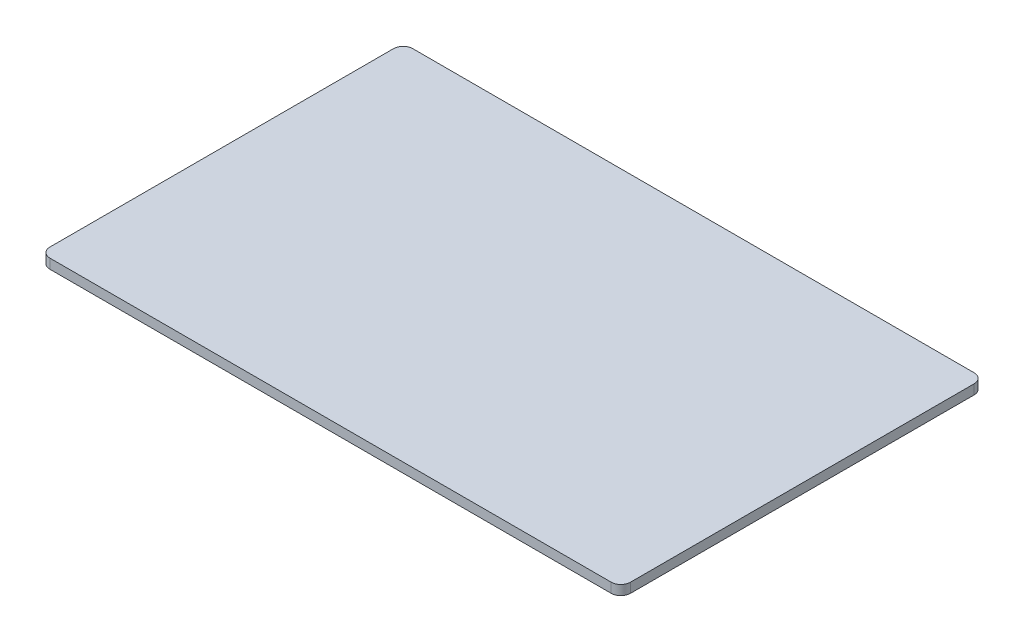
ISO-10303-21;
HEADER;
FILE_DESCRIPTION(('STEP AP214'),'2;1');
FILE_NAME('part.step','',(''),(''),'','','');
FILE_SCHEMA(('AUTOMOTIVE_DESIGN { 1 0 10303 214 1 1 1 1 }'));
ENDSEC;
DATA;
#1=APPLICATION_CONTEXT('core data for automotive mechanical design processes');
#2=APPLICATION_PROTOCOL_DEFINITION('international standard','automotive_design',2000,#1);
#3=PRODUCT_CONTEXT('',#1,'mechanical');
#4=PRODUCT('Part','Part','',(#3));
#5=PRODUCT_RELATED_PRODUCT_CATEGORY('part','',(#4));
#6=PRODUCT_DEFINITION_FORMATION('','',#4);
#7=PRODUCT_DEFINITION_CONTEXT('part definition',#1,'design');
#8=PRODUCT_DEFINITION('design','',#6,#7);
#9=PRODUCT_DEFINITION_SHAPE('','',#8);
#10=(LENGTH_UNIT() NAMED_UNIT(*) SI_UNIT(.MILLI.,.METRE.));
#11=(NAMED_UNIT(*) PLANE_ANGLE_UNIT() SI_UNIT($,.RADIAN.));
#12=(NAMED_UNIT(*) SI_UNIT($,.STERADIAN.) SOLID_ANGLE_UNIT());
#13=UNCERTAINTY_MEASURE_WITH_UNIT(LENGTH_MEASURE(1.E-05),#10,'distance_accuracy_value','');
#14=(GEOMETRIC_REPRESENTATION_CONTEXT(3) GLOBAL_UNCERTAINTY_ASSIGNED_CONTEXT((#13)) GLOBAL_UNIT_ASSIGNED_CONTEXT((#10,
#11,#12)) REPRESENTATION_CONTEXT('',''));
#15=CARTESIAN_POINT('',(0.,0.,0.));
#16=DIRECTION('',(0.,0.,1.));
#17=DIRECTION('',(1.,0.,0.));
#18=AXIS2_PLACEMENT_3D('',#15,#16,#17);
#19=CARTESIAN_POINT('',(-59.0049751243781,2.,-36.2189054726368));
#20=DIRECTION('',(1.,0.,0.));
#21=DIRECTION('',(0.,0.,-1.));
#22=AXIS2_PLACEMENT_3D('',#19,#20,#21);
#23=PLANE('',#22);
#24=DIRECTION('',(0.,0.,1.));
#25=VECTOR('',#24,1.);
#26=CARTESIAN_POINT('',(-59.0049751243781,2.,-36.2189054726368));
#27=LINE('',#26,#25);
#28=CARTESIAN_POINT('',(-59.0049751243781,2.,-34.2189054726368));
#29=VERTEX_POINT('',#28);
#30=CARTESIAN_POINT('',(-59.0049751243781,2.,36.7810945273632));
#31=VERTEX_POINT('',#30);
#32=EDGE_CURVE('E126',#29,#31,#27,.T.);
#33=ORIENTED_EDGE('',*,*,#32,.F.);
#34=DIRECTION('',(0.,-1.,0.));
#35=VECTOR('',#34,1.);
#36=CARTESIAN_POINT('',(-59.0049751243781,2.,-34.2189054726368));
#37=LINE('',#36,#35);
#38=CARTESIAN_POINT('',(-59.0049751243781,0.,-34.2189054726368));
#39=VERTEX_POINT('',#38);
#40=EDGE_CURVE('E111',#29,#39,#37,.T.);
#41=ORIENTED_EDGE('',*,*,#40,.T.);
#42=DIRECTION('',(0.,0.,1.));
#43=VECTOR('',#42,1.);
#44=CARTESIAN_POINT('',(-59.0049751243781,0.,-36.2189054726368));
#45=LINE('',#44,#43);
#46=CARTESIAN_POINT('',(-59.0049751243781,0.,36.7810945273632));
#47=VERTEX_POINT('',#46);
#48=EDGE_CURVE('E123',#39,#47,#45,.T.);
#49=ORIENTED_EDGE('',*,*,#48,.T.);
#50=DIRECTION('',(0.,-1.,0.));
#51=VECTOR('',#50,1.);
#52=CARTESIAN_POINT('',(-59.0049751243781,2.,36.7810945273632));
#53=LINE('',#52,#51);
#54=EDGE_CURVE('E128',#47,#31,#53,.F.);
#55=ORIENTED_EDGE('',*,*,#54,.T.);
#56=EDGE_LOOP('',(#33,#41,#49,#55));
#57=FACE_BOUND('',#56,.T.);
#58=ADVANCED_FACE('F41',(#57),#23,.F.);
#59=CARTESIAN_POINT('',(-59.0049751243781,2.,38.7810945273632));
#60=DIRECTION('',(0.,0.,-1.));
#61=DIRECTION('',(-1.,0.,0.));
#62=AXIS2_PLACEMENT_3D('',#59,#60,#61);
#63=PLANE('',#62);
#64=DIRECTION('',(1.,0.,0.));
#65=VECTOR('',#64,1.);
#66=CARTESIAN_POINT('',(-59.0049751243781,0.,38.7810945273632));
#67=LINE('',#66,#65);
#68=CARTESIAN_POINT('',(-57.0049751243781,0.,38.7810945273632));
#69=VERTEX_POINT('',#68);
#70=CARTESIAN_POINT('',(58.9950248756219,0.,38.7810945273632));
#71=VERTEX_POINT('',#70);
#72=EDGE_CURVE('E132',#69,#71,#67,.T.);
#73=ORIENTED_EDGE('',*,*,#72,.T.);
#74=DIRECTION('',(0.,-1.,0.));
#75=VECTOR('',#74,1.);
#76=CARTESIAN_POINT('',(58.9950248756219,2.,38.7810945273632));
#77=LINE('',#76,#75);
#78=CARTESIAN_POINT('',(58.9950248756219,2.,38.7810945273632));
#79=VERTEX_POINT('',#78);
#80=EDGE_CURVE('E11',#71,#79,#77,.F.);
#81=ORIENTED_EDGE('',*,*,#80,.T.);
#82=DIRECTION('',(1.,0.,0.));
#83=VECTOR('',#82,1.);
#84=CARTESIAN_POINT('',(-59.0049751243781,2.,38.7810945273632));
#85=LINE('',#84,#83);
#86=CARTESIAN_POINT('',(-57.0049751243781,2.,38.7810945273632));
#87=VERTEX_POINT('',#86);
#88=EDGE_CURVE('E168',#87,#79,#85,.T.);
#89=ORIENTED_EDGE('',*,*,#88,.F.);
#90=DIRECTION('',(0.,-1.,0.));
#91=VECTOR('',#90,1.);
#92=CARTESIAN_POINT('',(-57.0049751243781,2.,38.7810945273632));
#93=LINE('',#92,#91);
#94=EDGE_CURVE('E49',#87,#69,#93,.T.);
#95=ORIENTED_EDGE('',*,*,#94,.T.);
#96=EDGE_LOOP('',(#73,#81,#89,#95));
#97=FACE_BOUND('',#96,.T.);
#98=ADVANCED_FACE('F166',(#97),#63,.F.);
#99=CARTESIAN_POINT('',(60.9950248756219,2.,-36.2189054726368));
#100=DIRECTION('',(-1.,0.,0.));
#101=DIRECTION('',(0.,0.,1.));
#102=AXIS2_PLACEMENT_3D('',#99,#100,#101);
#103=PLANE('',#102);
#104=DIRECTION('',(0.,0.,-1.));
#105=VECTOR('',#104,1.);
#106=CARTESIAN_POINT('',(60.9950248756219,0.,-36.2189054726368));
#107=LINE('',#106,#105);
#108=CARTESIAN_POINT('',(60.9950248756219,0.,36.7810945273632));
#109=VERTEX_POINT('',#108);
#110=CARTESIAN_POINT('',(60.9950248756219,0.,-34.2189054726368));
#111=VERTEX_POINT('',#110);
#112=EDGE_CURVE('E135',#109,#111,#107,.T.);
#113=ORIENTED_EDGE('',*,*,#112,.T.);
#114=DIRECTION('',(0.,-1.,0.));
#115=VECTOR('',#114,1.);
#116=CARTESIAN_POINT('',(60.9950248756219,2.,-34.2189054726368));
#117=LINE('',#116,#115);
#118=CARTESIAN_POINT('',(60.9950248756219,2.,-34.2189054726368));
#119=VERTEX_POINT('',#118);
#120=EDGE_CURVE('E56',#111,#119,#117,.F.);
#121=ORIENTED_EDGE('',*,*,#120,.T.);
#122=DIRECTION('',(0.,0.,-1.));
#123=VECTOR('',#122,1.);
#124=CARTESIAN_POINT('',(60.9950248756219,2.,-36.2189054726368));
#125=LINE('',#124,#123);
#126=CARTESIAN_POINT('',(60.9950248756219,2.,36.7810945273632));
#127=VERTEX_POINT('',#126);
#128=EDGE_CURVE('E176',#127,#119,#125,.T.);
#129=ORIENTED_EDGE('',*,*,#128,.F.);
#130=DIRECTION('',(0.,-1.,0.));
#131=VECTOR('',#130,1.);
#132=CARTESIAN_POINT('',(60.9950248756219,2.,36.7810945273632));
#133=LINE('',#132,#131);
#134=EDGE_CURVE('E159',#127,#109,#133,.T.);
#135=ORIENTED_EDGE('',*,*,#134,.T.);
#136=EDGE_LOOP('',(#113,#121,#129,#135));
#137=FACE_BOUND('',#136,.T.);
#138=ADVANCED_FACE('F175',(#137),#103,.F.);
#139=CARTESIAN_POINT('',(-59.0049751243781,2.,-36.2189054726368));
#140=DIRECTION('',(0.,0.,1.));
#141=DIRECTION('',(1.,0.,0.));
#142=AXIS2_PLACEMENT_3D('',#139,#140,#141);
#143=PLANE('',#142);
#144=DIRECTION('',(-1.,0.,0.));
#145=VECTOR('',#144,1.);
#146=CARTESIAN_POINT('',(-59.0049751243781,0.,-36.2189054726368));
#147=LINE('',#146,#145);
#148=CARTESIAN_POINT('',(58.9950248756219,0.,-36.2189054726368));
#149=VERTEX_POINT('',#148);
#150=CARTESIAN_POINT('',(-57.0049751243781,0.,-36.2189054726368));
#151=VERTEX_POINT('',#150);
#152=EDGE_CURVE('E142',#149,#151,#147,.T.);
#153=ORIENTED_EDGE('',*,*,#152,.T.);
#154=DIRECTION('',(0.,-1.,0.));
#155=VECTOR('',#154,1.);
#156=CARTESIAN_POINT('',(-57.0049751243781,2.,-36.2189054726368));
#157=LINE('',#156,#155);
#158=CARTESIAN_POINT('',(-57.0049751243781,2.,-36.2189054726368));
#159=VERTEX_POINT('',#158);
#160=EDGE_CURVE('E112',#151,#159,#157,.F.);
#161=ORIENTED_EDGE('',*,*,#160,.T.);
#162=DIRECTION('',(-1.,0.,0.));
#163=VECTOR('',#162,1.);
#164=CARTESIAN_POINT('',(-59.0049751243781,2.,-36.2189054726368));
#165=LINE('',#164,#163);
#166=CARTESIAN_POINT('',(58.9950248756219,2.,-36.2189054726368));
#167=VERTEX_POINT('',#166);
#168=EDGE_CURVE('E138',#167,#159,#165,.T.);
#169=ORIENTED_EDGE('',*,*,#168,.F.);
#170=DIRECTION('',(0.,-1.,0.));
#171=VECTOR('',#170,1.);
#172=CARTESIAN_POINT('',(58.9950248756219,2.,-36.2189054726368));
#173=LINE('',#172,#171);
#174=EDGE_CURVE('E117',#167,#149,#173,.T.);
#175=ORIENTED_EDGE('',*,*,#174,.T.);
#176=EDGE_LOOP('',(#153,#161,#169,#175));
#177=FACE_BOUND('',#176,.T.);
#178=ADVANCED_FACE('F204',(#177),#143,.F.);
#179=CARTESIAN_POINT('',(0.,2.,0.));
#180=DIRECTION('',(0.,1.,0.));
#181=DIRECTION('',(0.,0.,1.));
#182=AXIS2_PLACEMENT_3D('',#179,#180,#181);
#183=PLANE('',#182);
#184=ORIENTED_EDGE('',*,*,#168,.T.);
#185=CARTESIAN_POINT('',(-57.0049751243781,2.,-34.2189054726368));
#186=DIRECTION('',(0.,1.,0.));
#187=DIRECTION('',(0.,0.,1.));
#188=AXIS2_PLACEMENT_3D('',#185,#186,#187);
#189=CIRCLE('',#188,2.);
#190=EDGE_CURVE('E157',#159,#29,#189,.T.);
#191=ORIENTED_EDGE('',*,*,#190,.T.);
#192=ORIENTED_EDGE('',*,*,#32,.T.);
#193=CARTESIAN_POINT('',(-57.0049751243781,2.,36.7810945273632));
#194=DIRECTION('',(0.,1.,0.));
#195=DIRECTION('',(0.,0.,1.));
#196=AXIS2_PLACEMENT_3D('',#193,#194,#195);
#197=CIRCLE('',#196,2.);
#198=EDGE_CURVE('E152',#31,#87,#197,.T.);
#199=ORIENTED_EDGE('',*,*,#198,.T.);
#200=ORIENTED_EDGE('',*,*,#88,.T.);
#201=CARTESIAN_POINT('',(58.9950248756219,2.,36.7810945273632));
#202=DIRECTION('',(0.,1.,0.));
#203=DIRECTION('',(0.,0.,1.));
#204=AXIS2_PLACEMENT_3D('',#201,#202,#203);
#205=CIRCLE('',#204,2.);
#206=EDGE_CURVE('E63',#79,#127,#205,.T.);
#207=ORIENTED_EDGE('',*,*,#206,.T.);
#208=ORIENTED_EDGE('',*,*,#128,.T.);
#209=CARTESIAN_POINT('',(58.9950248756219,2.,-34.2189054726368));
#210=DIRECTION('',(0.,1.,0.));
#211=DIRECTION('',(0.,0.,1.));
#212=AXIS2_PLACEMENT_3D('',#209,#210,#211);
#213=CIRCLE('',#212,2.);
#214=EDGE_CURVE('E155',#119,#167,#213,.T.);
#215=ORIENTED_EDGE('',*,*,#214,.T.);
#216=EDGE_LOOP('',(#184,#191,#192,#199,#200,#207,#208,#215));
#217=FACE_BOUND('',#216,.T.);
#218=ADVANCED_FACE('F181',(#217),#183,.T.);
#219=CARTESIAN_POINT('',(0.,0.,0.));
#220=DIRECTION('',(0.,1.,0.));
#221=DIRECTION('',(0.,0.,1.));
#222=AXIS2_PLACEMENT_3D('',#219,#220,#221);
#223=PLANE('',#222);
#224=ORIENTED_EDGE('',*,*,#48,.F.);
#225=CARTESIAN_POINT('',(-57.0049751243781,0.,-34.2189054726368));
#226=DIRECTION('',(0.,1.,0.));
#227=DIRECTION('',(0.,0.,1.));
#228=AXIS2_PLACEMENT_3D('',#225,#226,#227);
#229=CIRCLE('',#228,2.);
#230=EDGE_CURVE('E107',#39,#151,#229,.F.);
#231=ORIENTED_EDGE('',*,*,#230,.T.);
#232=ORIENTED_EDGE('',*,*,#152,.F.);
#233=CARTESIAN_POINT('',(58.9950248756219,0.,-34.2189054726368));
#234=DIRECTION('',(0.,1.,0.));
#235=DIRECTION('',(0.,0.,1.));
#236=AXIS2_PLACEMENT_3D('',#233,#234,#235);
#237=CIRCLE('',#236,2.);
#238=EDGE_CURVE('E118',#149,#111,#237,.F.);
#239=ORIENTED_EDGE('',*,*,#238,.T.);
#240=ORIENTED_EDGE('',*,*,#112,.F.);
#241=CARTESIAN_POINT('',(58.9950248756219,0.,36.7810945273632));
#242=DIRECTION('',(0.,1.,0.));
#243=DIRECTION('',(0.,0.,1.));
#244=AXIS2_PLACEMENT_3D('',#241,#242,#243);
#245=CIRCLE('',#244,2.);
#246=EDGE_CURVE('E146',#109,#71,#245,.F.);
#247=ORIENTED_EDGE('',*,*,#246,.T.);
#248=ORIENTED_EDGE('',*,*,#72,.F.);
#249=CARTESIAN_POINT('',(-57.0049751243781,0.,36.7810945273632));
#250=DIRECTION('',(0.,1.,0.));
#251=DIRECTION('',(0.,0.,1.));
#252=AXIS2_PLACEMENT_3D('',#249,#250,#251);
#253=CIRCLE('',#252,2.);
#254=EDGE_CURVE('E127',#69,#47,#253,.F.);
#255=ORIENTED_EDGE('',*,*,#254,.T.);
#256=EDGE_LOOP('',(#224,#231,#232,#239,#240,#247,#248,#255));
#257=FACE_BOUND('',#256,.T.);
#258=ADVANCED_FACE('F130',(#257),#223,.F.);
#259=CARTESIAN_POINT('',(-57.0049751243781,2.,-34.2189054726368));
#260=DIRECTION('',(0.,-1.,0.));
#261=DIRECTION('',(0.,0.,-1.));
#262=AXIS2_PLACEMENT_3D('',#259,#260,#261);
#263=CYLINDRICAL_SURFACE('',#262,2.);
#264=ORIENTED_EDGE('',*,*,#190,.F.);
#265=ORIENTED_EDGE('',*,*,#160,.F.);
#266=ORIENTED_EDGE('',*,*,#230,.F.);
#267=ORIENTED_EDGE('',*,*,#40,.F.);
#268=EDGE_LOOP('',(#264,#265,#266,#267));
#269=FACE_BOUND('',#268,.T.);
#270=ADVANCED_FACE('F110',(#269),#263,.T.);
#271=CARTESIAN_POINT('',(58.9950248756219,2.,-34.2189054726368));
#272=DIRECTION('',(0.,-1.,0.));
#273=DIRECTION('',(0.,0.,-1.));
#274=AXIS2_PLACEMENT_3D('',#271,#272,#273);
#275=CYLINDRICAL_SURFACE('',#274,2.);
#276=ORIENTED_EDGE('',*,*,#214,.F.);
#277=ORIENTED_EDGE('',*,*,#120,.F.);
#278=ORIENTED_EDGE('',*,*,#238,.F.);
#279=ORIENTED_EDGE('',*,*,#174,.F.);
#280=EDGE_LOOP('',(#276,#277,#278,#279));
#281=FACE_BOUND('',#280,.T.);
#282=ADVANCED_FACE('F186',(#281),#275,.T.);
#283=CARTESIAN_POINT('',(58.9950248756219,2.,36.7810945273632));
#284=DIRECTION('',(0.,-1.,0.));
#285=DIRECTION('',(0.,0.,-1.));
#286=AXIS2_PLACEMENT_3D('',#283,#284,#285);
#287=CYLINDRICAL_SURFACE('',#286,2.);
#288=ORIENTED_EDGE('',*,*,#206,.F.);
#289=ORIENTED_EDGE('',*,*,#80,.F.);
#290=ORIENTED_EDGE('',*,*,#246,.F.);
#291=ORIENTED_EDGE('',*,*,#134,.F.);
#292=EDGE_LOOP('',(#288,#289,#290,#291));
#293=FACE_BOUND('',#292,.T.);
#294=ADVANCED_FACE('F174',(#293),#287,.T.);
#295=CARTESIAN_POINT('',(-57.0049751243781,2.,36.7810945273632));
#296=DIRECTION('',(0.,-1.,0.));
#297=DIRECTION('',(0.,0.,-1.));
#298=AXIS2_PLACEMENT_3D('',#295,#296,#297);
#299=CYLINDRICAL_SURFACE('',#298,2.);
#300=ORIENTED_EDGE('',*,*,#198,.F.);
#301=ORIENTED_EDGE('',*,*,#54,.F.);
#302=ORIENTED_EDGE('',*,*,#254,.F.);
#303=ORIENTED_EDGE('',*,*,#94,.F.);
#304=EDGE_LOOP('',(#300,#301,#302,#303));
#305=FACE_BOUND('',#304,.T.);
#306=ADVANCED_FACE('F43',(#305),#299,.T.);
#307=CLOSED_SHELL('',(#58,#98,#138,#178,#218,#258,#270,#282,#294,#306));
#308=MANIFOLD_SOLID_BREP('B2',#307);
#309=ADVANCED_BREP_SHAPE_REPRESENTATION('',(#18,#308),#14);
#310=SHAPE_DEFINITION_REPRESENTATION(#9,#309);
ENDSEC;
END-ISO-10303-21;
